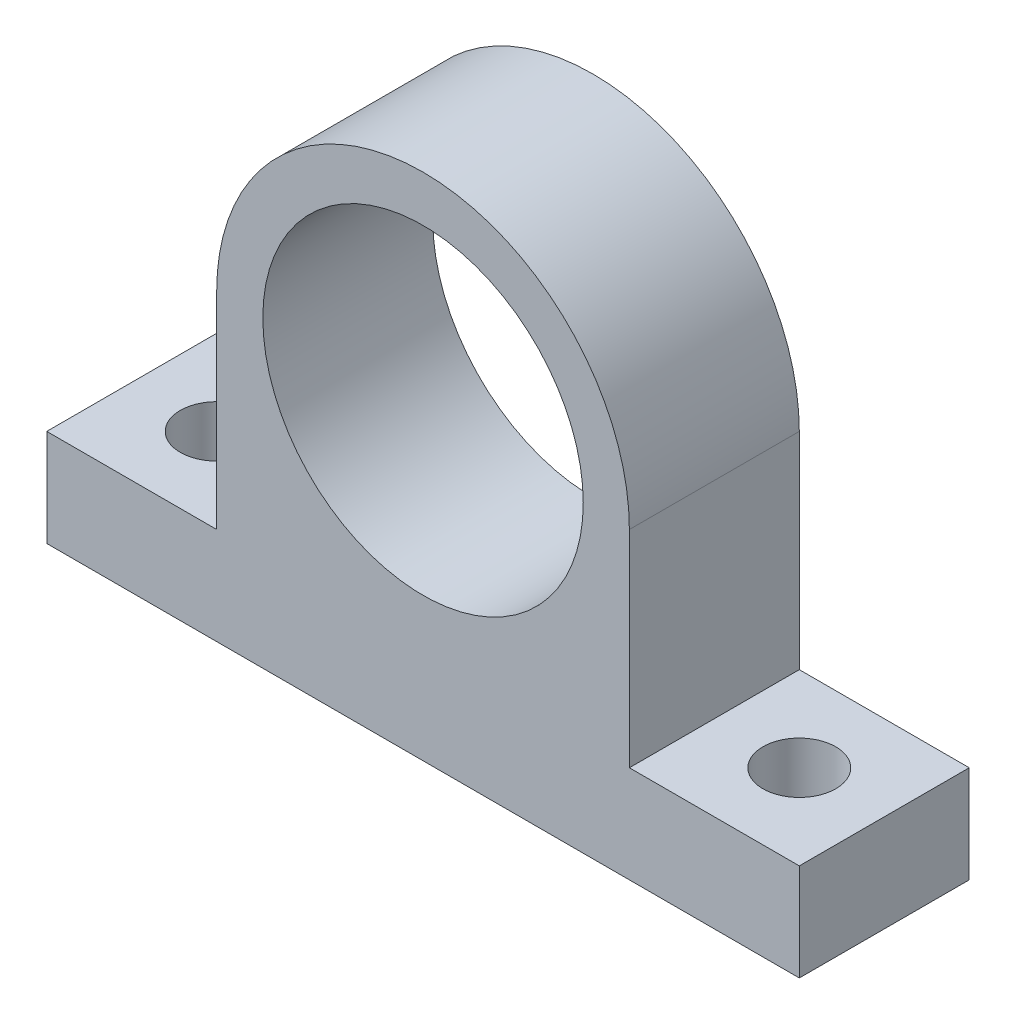
ISO-10303-21;
HEADER;
FILE_DESCRIPTION(('STEP AP214'),'2;1');
FILE_NAME('part.step','',(''),(''),'','','');
FILE_SCHEMA(('AUTOMOTIVE_DESIGN { 1 0 10303 214 1 1 1 1 }'));
ENDSEC;
DATA;
#1=APPLICATION_CONTEXT('core data for automotive mechanical design processes');
#2=APPLICATION_PROTOCOL_DEFINITION('international standard','automotive_design',2000,#1);
#3=PRODUCT_CONTEXT('',#1,'mechanical');
#4=PRODUCT('Part','Part','',(#3));
#5=PRODUCT_RELATED_PRODUCT_CATEGORY('part','',(#4));
#6=PRODUCT_DEFINITION_FORMATION('','',#4);
#7=PRODUCT_DEFINITION_CONTEXT('part definition',#1,'design');
#8=PRODUCT_DEFINITION('design','',#6,#7);
#9=PRODUCT_DEFINITION_SHAPE('','',#8);
#10=(LENGTH_UNIT() NAMED_UNIT(*) SI_UNIT(.MILLI.,.METRE.));
#11=(NAMED_UNIT(*) PLANE_ANGLE_UNIT() SI_UNIT($,.RADIAN.));
#12=(NAMED_UNIT(*) SI_UNIT($,.STERADIAN.) SOLID_ANGLE_UNIT());
#13=UNCERTAINTY_MEASURE_WITH_UNIT(LENGTH_MEASURE(1.E-05),#10,'distance_accuracy_value','');
#14=(GEOMETRIC_REPRESENTATION_CONTEXT(3) GLOBAL_UNCERTAINTY_ASSIGNED_CONTEXT((#13)) GLOBAL_UNIT_ASSIGNED_CONTEXT((#10,
#11,#12)) REPRESENTATION_CONTEXT('',''));
#15=CARTESIAN_POINT('',(0.,0.,0.));
#16=DIRECTION('',(0.,0.,1.));
#17=DIRECTION('',(1.,0.,0.));
#18=AXIS2_PLACEMENT_3D('',#15,#16,#17);
#19=CARTESIAN_POINT('',(0.,0.,7.));
#20=DIRECTION('',(0.,0.,1.));
#21=DIRECTION('',(1.,0.,0.));
#22=AXIS2_PLACEMENT_3D('',#19,#20,#21);
#23=PLANE('',#22);
#24=CARTESIAN_POINT('',(0.,0.,7.));
#25=DIRECTION('',(0.,0.,1.));
#26=DIRECTION('',(1.,0.,0.));
#27=AXIS2_PLACEMENT_3D('',#24,#25,#26);
#28=CIRCLE('',#27,8.5);
#29=CARTESIAN_POINT('',(8.5,0.,7.));
#30=VERTEX_POINT('',#29);
#31=CARTESIAN_POINT('',(-8.5,0.,7.));
#32=VERTEX_POINT('',#31);
#33=EDGE_CURVE('E165',#30,#32,#28,.T.);
#34=ORIENTED_EDGE('',*,*,#33,.T.);
#35=DIRECTION('',(0.,-1.,0.));
#36=VECTOR('',#35,1.);
#37=CARTESIAN_POINT('',(-8.5,0.,7.));
#38=LINE('',#37,#36);
#39=CARTESIAN_POINT('',(-8.5,-8.5,7.));
#40=VERTEX_POINT('',#39);
#41=EDGE_CURVE('E100',#32,#40,#38,.T.);
#42=ORIENTED_EDGE('',*,*,#41,.T.);
#43=DIRECTION('',(-1.,0.,0.));
#44=VECTOR('',#43,1.);
#45=CARTESIAN_POINT('',(-8.5,-8.5,7.));
#46=LINE('',#45,#44);
#47=CARTESIAN_POINT('',(-15.5,-8.5,7.));
#48=VERTEX_POINT('',#47);
#49=EDGE_CURVE('E186',#40,#48,#46,.T.);
#50=ORIENTED_EDGE('',*,*,#49,.T.);
#51=DIRECTION('',(0.,-1.,0.));
#52=VECTOR('',#51,1.);
#53=CARTESIAN_POINT('',(-15.5,-8.5,7.));
#54=LINE('',#53,#52);
#55=CARTESIAN_POINT('',(-15.5,-12.5,7.));
#56=VERTEX_POINT('',#55);
#57=EDGE_CURVE('E199',#48,#56,#54,.T.);
#58=ORIENTED_EDGE('',*,*,#57,.T.);
#59=DIRECTION('',(1.,0.,0.));
#60=VECTOR('',#59,1.);
#61=CARTESIAN_POINT('',(-15.5,-12.5,7.));
#62=LINE('',#61,#60);
#63=CARTESIAN_POINT('',(15.5,-12.5,7.));
#64=VERTEX_POINT('',#63);
#65=EDGE_CURVE('E119',#56,#64,#62,.T.);
#66=ORIENTED_EDGE('',*,*,#65,.T.);
#67=DIRECTION('',(0.,1.,0.));
#68=VECTOR('',#67,1.);
#69=CARTESIAN_POINT('',(15.5,-8.5,7.));
#70=LINE('',#69,#68);
#71=CARTESIAN_POINT('',(15.5,-8.5,7.));
#72=VERTEX_POINT('',#71);
#73=EDGE_CURVE('E113',#64,#72,#70,.T.);
#74=ORIENTED_EDGE('',*,*,#73,.T.);
#75=DIRECTION('',(-1.,0.,0.));
#76=VECTOR('',#75,1.);
#77=CARTESIAN_POINT('',(8.5,-8.5,7.));
#78=LINE('',#77,#76);
#79=CARTESIAN_POINT('',(8.5,-8.5,7.));
#80=VERTEX_POINT('',#79);
#81=EDGE_CURVE('E117',#72,#80,#78,.T.);
#82=ORIENTED_EDGE('',*,*,#81,.T.);
#83=DIRECTION('',(0.,1.,0.));
#84=VECTOR('',#83,1.);
#85=CARTESIAN_POINT('',(8.5,0.,7.));
#86=LINE('',#85,#84);
#87=EDGE_CURVE('E57',#80,#30,#86,.T.);
#88=ORIENTED_EDGE('',*,*,#87,.T.);
#89=EDGE_LOOP('',(#34,#42,#50,#58,#66,#74,#82,#88));
#90=FACE_BOUND('',#89,.T.);
#91=CARTESIAN_POINT('',(0.,0.,7.));
#92=DIRECTION('',(0.,0.,1.));
#93=DIRECTION('',(1.,0.,0.));
#94=AXIS2_PLACEMENT_3D('',#91,#92,#93);
#95=CIRCLE('',#94,6.6);
#96=CARTESIAN_POINT('',(6.6,0.,7.));
#97=VERTEX_POINT('',#96);
#98=EDGE_CURVE('E146',#97,#97,#95,.T.);
#99=ORIENTED_EDGE('',*,*,#98,.F.);
#100=EDGE_LOOP('',(#99));
#101=FACE_BOUND('',#100,.T.);
#102=ADVANCED_FACE('F39',(#90,#101),#23,.T.);
#103=CARTESIAN_POINT('',(0.,0.,0.));
#104=DIRECTION('',(0.,0.,1.));
#105=DIRECTION('',(1.,0.,0.));
#106=AXIS2_PLACEMENT_3D('',#103,#104,#105);
#107=PLANE('',#106);
#108=CARTESIAN_POINT('',(0.,0.,0.));
#109=DIRECTION('',(0.,0.,1.));
#110=DIRECTION('',(1.,0.,0.));
#111=AXIS2_PLACEMENT_3D('',#108,#109,#110);
#112=CIRCLE('',#111,8.5);
#113=CARTESIAN_POINT('',(8.5,0.,0.));
#114=VERTEX_POINT('',#113);
#115=CARTESIAN_POINT('',(-8.5,0.,0.));
#116=VERTEX_POINT('',#115);
#117=EDGE_CURVE('E141',#114,#116,#112,.T.);
#118=ORIENTED_EDGE('',*,*,#117,.F.);
#119=DIRECTION('',(0.,1.,0.));
#120=VECTOR('',#119,1.);
#121=CARTESIAN_POINT('',(8.5,0.,0.));
#122=LINE('',#121,#120);
#123=CARTESIAN_POINT('',(8.5,-8.5,0.));
#124=VERTEX_POINT('',#123);
#125=EDGE_CURVE('E92',#124,#114,#122,.T.);
#126=ORIENTED_EDGE('',*,*,#125,.F.);
#127=DIRECTION('',(-1.,0.,0.));
#128=VECTOR('',#127,1.);
#129=CARTESIAN_POINT('',(8.5,-8.5,0.));
#130=LINE('',#129,#128);
#131=CARTESIAN_POINT('',(15.5,-8.5,0.));
#132=VERTEX_POINT('',#131);
#133=EDGE_CURVE('E86',#132,#124,#130,.T.);
#134=ORIENTED_EDGE('',*,*,#133,.F.);
#135=DIRECTION('',(0.,1.,0.));
#136=VECTOR('',#135,1.);
#137=CARTESIAN_POINT('',(15.5,-8.5,0.));
#138=LINE('',#137,#136);
#139=CARTESIAN_POINT('',(15.5,-12.5,0.));
#140=VERTEX_POINT('',#139);
#141=EDGE_CURVE('E128',#140,#132,#138,.T.);
#142=ORIENTED_EDGE('',*,*,#141,.F.);
#143=DIRECTION('',(1.,0.,0.));
#144=VECTOR('',#143,1.);
#145=CARTESIAN_POINT('',(15.5,-12.5,0.));
#146=LINE('',#145,#144);
#147=CARTESIAN_POINT('',(-15.5,-12.5,0.));
#148=VERTEX_POINT('',#147);
#149=EDGE_CURVE('E156',#148,#140,#146,.T.);
#150=ORIENTED_EDGE('',*,*,#149,.F.);
#151=DIRECTION('',(0.,-1.,0.));
#152=VECTOR('',#151,1.);
#153=CARTESIAN_POINT('',(-15.5,-8.5,0.));
#154=LINE('',#153,#152);
#155=CARTESIAN_POINT('',(-15.5,-8.5,0.));
#156=VERTEX_POINT('',#155);
#157=EDGE_CURVE('E152',#156,#148,#154,.T.);
#158=ORIENTED_EDGE('',*,*,#157,.F.);
#159=DIRECTION('',(-1.,0.,0.));
#160=VECTOR('',#159,1.);
#161=CARTESIAN_POINT('',(-8.5,-8.5,0.));
#162=LINE('',#161,#160);
#163=CARTESIAN_POINT('',(-8.5,-8.5,0.));
#164=VERTEX_POINT('',#163);
#165=EDGE_CURVE('E149',#164,#156,#162,.T.);
#166=ORIENTED_EDGE('',*,*,#165,.F.);
#167=DIRECTION('',(0.,-1.,0.));
#168=VECTOR('',#167,1.);
#169=CARTESIAN_POINT('',(-8.5,0.,0.));
#170=LINE('',#169,#168);
#171=EDGE_CURVE('E145',#116,#164,#170,.T.);
#172=ORIENTED_EDGE('',*,*,#171,.F.);
#173=EDGE_LOOP('',(#118,#126,#134,#142,#150,#158,#166,#172));
#174=FACE_BOUND('',#173,.T.);
#175=CARTESIAN_POINT('',(0.,0.,0.));
#176=DIRECTION('',(0.,0.,1.));
#177=DIRECTION('',(1.,0.,0.));
#178=AXIS2_PLACEMENT_3D('',#175,#176,#177);
#179=CIRCLE('',#178,6.6);
#180=CARTESIAN_POINT('',(6.6,0.,0.));
#181=VERTEX_POINT('',#180);
#182=EDGE_CURVE('E209',#181,#181,#179,.T.);
#183=ORIENTED_EDGE('',*,*,#182,.T.);
#184=EDGE_LOOP('',(#183));
#185=FACE_BOUND('',#184,.T.);
#186=ADVANCED_FACE('F190',(#174,#185),#107,.F.);
#187=CARTESIAN_POINT('',(0.,0.,7.));
#188=DIRECTION('',(0.,0.,-1.));
#189=DIRECTION('',(-1.,0.,0.));
#190=AXIS2_PLACEMENT_3D('',#187,#188,#189);
#191=CYLINDRICAL_SURFACE('',#190,8.5);
#192=ORIENTED_EDGE('',*,*,#117,.T.);
#193=DIRECTION('',(0.,0.,-1.));
#194=VECTOR('',#193,1.);
#195=CARTESIAN_POINT('',(-8.5,0.,7.));
#196=LINE('',#195,#194);
#197=EDGE_CURVE('E11',#32,#116,#196,.T.);
#198=ORIENTED_EDGE('',*,*,#197,.F.);
#199=ORIENTED_EDGE('',*,*,#33,.F.);
#200=DIRECTION('',(0.,0.,-1.));
#201=VECTOR('',#200,1.);
#202=CARTESIAN_POINT('',(8.5,0.,7.));
#203=LINE('',#202,#201);
#204=EDGE_CURVE('E137',#30,#114,#203,.T.);
#205=ORIENTED_EDGE('',*,*,#204,.T.);
#206=EDGE_LOOP('',(#192,#198,#199,#205));
#207=FACE_BOUND('',#206,.T.);
#208=ADVANCED_FACE('F41',(#207),#191,.T.);
#209=CARTESIAN_POINT('',(-8.5,0.,7.));
#210=DIRECTION('',(1.,0.,0.));
#211=DIRECTION('',(0.,0.,-1.));
#212=AXIS2_PLACEMENT_3D('',#209,#210,#211);
#213=PLANE('',#212);
#214=ORIENTED_EDGE('',*,*,#171,.T.);
#215=DIRECTION('',(0.,0.,-1.));
#216=VECTOR('',#215,1.);
#217=CARTESIAN_POINT('',(-8.5,-8.5,7.));
#218=LINE('',#217,#216);
#219=EDGE_CURVE('E49',#40,#164,#218,.T.);
#220=ORIENTED_EDGE('',*,*,#219,.F.);
#221=ORIENTED_EDGE('',*,*,#41,.F.);
#222=ORIENTED_EDGE('',*,*,#197,.T.);
#223=EDGE_LOOP('',(#214,#220,#221,#222));
#224=FACE_BOUND('',#223,.T.);
#225=ADVANCED_FACE('F243',(#224),#213,.F.);
#226=CARTESIAN_POINT('',(-8.5,-8.5,7.));
#227=DIRECTION('',(0.,-1.,0.));
#228=DIRECTION('',(1.,0.,0.));
#229=AXIS2_PLACEMENT_3D('',#226,#227,#228);
#230=PLANE('',#229);
#231=CARTESIAN_POINT('',(-12.,-8.5,3.5));
#232=DIRECTION('',(0.,1.,0.));
#233=DIRECTION('',(-1.,0.,0.));
#234=AXIS2_PLACEMENT_3D('',#231,#232,#233);
#235=CIRCLE('',#234,1.5);
#236=CARTESIAN_POINT('',(-13.5,-8.5,3.5));
#237=VERTEX_POINT('',#236);
#238=EDGE_CURVE('E225',#237,#237,#235,.T.);
#239=ORIENTED_EDGE('',*,*,#238,.F.);
#240=EDGE_LOOP('',(#239));
#241=FACE_BOUND('',#240,.T.);
#242=ORIENTED_EDGE('',*,*,#165,.T.);
#243=DIRECTION('',(0.,0.,-1.));
#244=VECTOR('',#243,1.);
#245=CARTESIAN_POINT('',(-15.5,-8.5,7.));
#246=LINE('',#245,#244);
#247=EDGE_CURVE('E176',#48,#156,#246,.T.);
#248=ORIENTED_EDGE('',*,*,#247,.F.);
#249=ORIENTED_EDGE('',*,*,#49,.F.);
#250=ORIENTED_EDGE('',*,*,#219,.T.);
#251=EDGE_LOOP('',(#242,#248,#249,#250));
#252=FACE_BOUND('',#251,.T.);
#253=ADVANCED_FACE('F184',(#241,#252),#230,.F.);
#254=CARTESIAN_POINT('',(-15.5,-8.5,7.));
#255=DIRECTION('',(1.,0.,0.));
#256=DIRECTION('',(0.,0.,-1.));
#257=AXIS2_PLACEMENT_3D('',#254,#255,#256);
#258=PLANE('',#257);
#259=ORIENTED_EDGE('',*,*,#157,.T.);
#260=DIRECTION('',(0.,0.,-1.));
#261=VECTOR('',#260,1.);
#262=CARTESIAN_POINT('',(-15.5,-12.5,7.));
#263=LINE('',#262,#261);
#264=EDGE_CURVE('E172',#56,#148,#263,.T.);
#265=ORIENTED_EDGE('',*,*,#264,.F.);
#266=ORIENTED_EDGE('',*,*,#57,.F.);
#267=ORIENTED_EDGE('',*,*,#247,.T.);
#268=EDGE_LOOP('',(#259,#265,#266,#267));
#269=FACE_BOUND('',#268,.T.);
#270=ADVANCED_FACE('F194',(#269),#258,.F.);
#271=CARTESIAN_POINT('',(15.5,-12.5,7.));
#272=DIRECTION('',(0.,1.,0.));
#273=DIRECTION('',(0.,0.,1.));
#274=AXIS2_PLACEMENT_3D('',#271,#272,#273);
#275=PLANE('',#274);
#276=CARTESIAN_POINT('',(-12.,-12.5,3.5));
#277=DIRECTION('',(0.,1.,0.));
#278=DIRECTION('',(-1.,0.,0.));
#279=AXIS2_PLACEMENT_3D('',#276,#277,#278);
#280=CIRCLE('',#279,1.5);
#281=CARTESIAN_POINT('',(-13.5,-12.5,3.5));
#282=VERTEX_POINT('',#281);
#283=EDGE_CURVE('E213',#282,#282,#280,.T.);
#284=ORIENTED_EDGE('',*,*,#283,.T.);
#285=EDGE_LOOP('',(#284));
#286=FACE_BOUND('',#285,.T.);
#287=CARTESIAN_POINT('',(12.,-12.5,3.5));
#288=DIRECTION('',(0.,1.,0.));
#289=DIRECTION('',(1.,0.,0.));
#290=AXIS2_PLACEMENT_3D('',#287,#288,#289);
#291=CIRCLE('',#290,1.5);
#292=CARTESIAN_POINT('',(13.5,-12.5,3.5));
#293=VERTEX_POINT('',#292);
#294=EDGE_CURVE('E221',#293,#293,#291,.T.);
#295=ORIENTED_EDGE('',*,*,#294,.T.);
#296=EDGE_LOOP('',(#295));
#297=FACE_BOUND('',#296,.T.);
#298=ORIENTED_EDGE('',*,*,#149,.T.);
#299=DIRECTION('',(0.,0.,-1.));
#300=VECTOR('',#299,1.);
#301=CARTESIAN_POINT('',(15.5,-12.5,7.));
#302=LINE('',#301,#300);
#303=EDGE_CURVE('E130',#64,#140,#302,.T.);
#304=ORIENTED_EDGE('',*,*,#303,.F.);
#305=ORIENTED_EDGE('',*,*,#65,.F.);
#306=ORIENTED_EDGE('',*,*,#264,.T.);
#307=EDGE_LOOP('',(#298,#304,#305,#306));
#308=FACE_BOUND('',#307,.T.);
#309=ADVANCED_FACE('F197',(#286,#297,#308),#275,.F.);
#310=CARTESIAN_POINT('',(15.5,-8.5,7.));
#311=DIRECTION('',(-1.,0.,0.));
#312=DIRECTION('',(0.,0.,1.));
#313=AXIS2_PLACEMENT_3D('',#310,#311,#312);
#314=PLANE('',#313);
#315=ORIENTED_EDGE('',*,*,#141,.T.);
#316=DIRECTION('',(0.,0.,-1.));
#317=VECTOR('',#316,1.);
#318=CARTESIAN_POINT('',(15.5,-8.5,7.));
#319=LINE('',#318,#317);
#320=EDGE_CURVE('E125',#72,#132,#319,.T.);
#321=ORIENTED_EDGE('',*,*,#320,.F.);
#322=ORIENTED_EDGE('',*,*,#73,.F.);
#323=ORIENTED_EDGE('',*,*,#303,.T.);
#324=EDGE_LOOP('',(#315,#321,#322,#323));
#325=FACE_BOUND('',#324,.T.);
#326=ADVANCED_FACE('F126',(#325),#314,.F.);
#327=CARTESIAN_POINT('',(8.5,-8.5,7.));
#328=DIRECTION('',(0.,-1.,0.));
#329=DIRECTION('',(0.,0.,-1.));
#330=AXIS2_PLACEMENT_3D('',#327,#328,#329);
#331=PLANE('',#330);
#332=CARTESIAN_POINT('',(12.,-8.49999999999999,3.5));
#333=DIRECTION('',(0.,1.,0.));
#334=DIRECTION('',(1.,0.,0.));
#335=AXIS2_PLACEMENT_3D('',#332,#333,#334);
#336=CIRCLE('',#335,1.5);
#337=CARTESIAN_POINT('',(13.5,-8.49999999999999,3.5));
#338=VERTEX_POINT('',#337);
#339=EDGE_CURVE('E217',#338,#338,#336,.T.);
#340=ORIENTED_EDGE('',*,*,#339,.F.);
#341=EDGE_LOOP('',(#340));
#342=FACE_BOUND('',#341,.T.);
#343=ORIENTED_EDGE('',*,*,#133,.T.);
#344=DIRECTION('',(0.,0.,-1.));
#345=VECTOR('',#344,1.);
#346=CARTESIAN_POINT('',(8.5,-8.5,7.));
#347=LINE('',#346,#345);
#348=EDGE_CURVE('E131',#80,#124,#347,.T.);
#349=ORIENTED_EDGE('',*,*,#348,.F.);
#350=ORIENTED_EDGE('',*,*,#81,.F.);
#351=ORIENTED_EDGE('',*,*,#320,.T.);
#352=EDGE_LOOP('',(#343,#349,#350,#351));
#353=FACE_BOUND('',#352,.T.);
#354=ADVANCED_FACE('F133',(#342,#353),#331,.F.);
#355=CARTESIAN_POINT('',(8.5,0.,7.));
#356=DIRECTION('',(-1.,0.,0.));
#357=DIRECTION('',(0.,0.,1.));
#358=AXIS2_PLACEMENT_3D('',#355,#356,#357);
#359=PLANE('',#358);
#360=ORIENTED_EDGE('',*,*,#125,.T.);
#361=ORIENTED_EDGE('',*,*,#204,.F.);
#362=ORIENTED_EDGE('',*,*,#87,.F.);
#363=ORIENTED_EDGE('',*,*,#348,.T.);
#364=EDGE_LOOP('',(#360,#361,#362,#363));
#365=FACE_BOUND('',#364,.T.);
#366=ADVANCED_FACE('F260',(#365),#359,.F.);
#367=CARTESIAN_POINT('',(0.,0.,7.));
#368=DIRECTION('',(0.,0.,-1.));
#369=DIRECTION('',(-1.,0.,0.));
#370=AXIS2_PLACEMENT_3D('',#367,#368,#369);
#371=CYLINDRICAL_SURFACE('',#370,6.6);
#372=ORIENTED_EDGE('',*,*,#98,.T.);
#373=EDGE_LOOP('',(#372));
#374=FACE_BOUND('',#373,.T.);
#375=ORIENTED_EDGE('',*,*,#182,.F.);
#376=EDGE_LOOP('',(#375));
#377=FACE_BOUND('',#376,.T.);
#378=ADVANCED_FACE('F257',(#374,#377),#371,.F.);
#379=CARTESIAN_POINT('',(12.,-12.5,3.5));
#380=DIRECTION('',(0.,1.,0.));
#381=DIRECTION('',(-1.,0.,0.));
#382=AXIS2_PLACEMENT_3D('',#379,#380,#381);
#383=CYLINDRICAL_SURFACE('',#382,1.5);
#384=ORIENTED_EDGE('',*,*,#294,.F.);
#385=EDGE_LOOP('',(#384));
#386=FACE_BOUND('',#385,.T.);
#387=ORIENTED_EDGE('',*,*,#339,.T.);
#388=EDGE_LOOP('',(#387));
#389=FACE_BOUND('',#388,.T.);
#390=ADVANCED_FACE('F238',(#386,#389),#383,.F.);
#391=CARTESIAN_POINT('',(-12.,-12.5,3.5));
#392=DIRECTION('',(0.,1.,0.));
#393=DIRECTION('',(-1.,0.,0.));
#394=AXIS2_PLACEMENT_3D('',#391,#392,#393);
#395=CYLINDRICAL_SURFACE('',#394,1.5);
#396=ORIENTED_EDGE('',*,*,#283,.F.);
#397=EDGE_LOOP('',(#396));
#398=FACE_BOUND('',#397,.T.);
#399=ORIENTED_EDGE('',*,*,#238,.T.);
#400=EDGE_LOOP('',(#399));
#401=FACE_BOUND('',#400,.T.);
#402=ADVANCED_FACE('F235',(#398,#401),#395,.F.);
#403=CLOSED_SHELL('',(#102,#186,#208,#225,#253,#270,#309,#326,#354,#366,#378,#390,#402));
#404=MANIFOLD_SOLID_BREP('B2',#403);
#405=ADVANCED_BREP_SHAPE_REPRESENTATION('',(#18,#404),#14);
#406=SHAPE_DEFINITION_REPRESENTATION(#9,#405);
ENDSEC;
END-ISO-10303-21;
